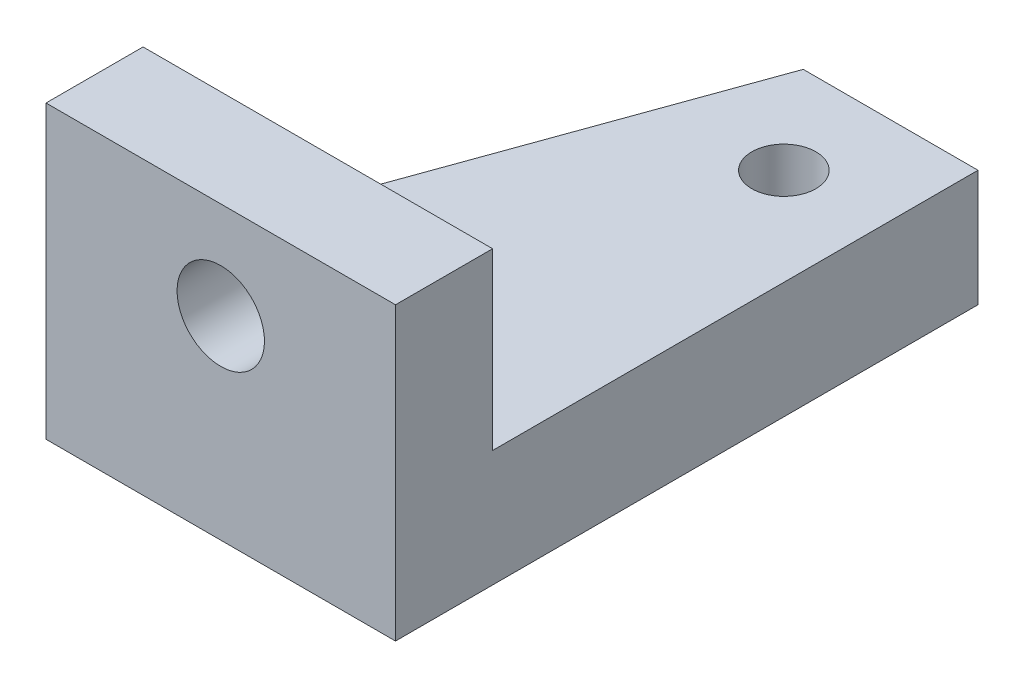
ISO-10303-21;
HEADER;
FILE_DESCRIPTION(('STEP AP214'),'2;1');
FILE_NAME('part.step','',(''),(''),'','','');
FILE_SCHEMA(('AUTOMOTIVE_DESIGN { 1 0 10303 214 1 1 1 1 }'));
ENDSEC;
DATA;
#1=APPLICATION_CONTEXT('core data for automotive mechanical design processes');
#2=APPLICATION_PROTOCOL_DEFINITION('international standard','automotive_design',2000,#1);
#3=PRODUCT_CONTEXT('',#1,'mechanical');
#4=PRODUCT('Part','Part','',(#3));
#5=PRODUCT_RELATED_PRODUCT_CATEGORY('part','',(#4));
#6=PRODUCT_DEFINITION_FORMATION('','',#4);
#7=PRODUCT_DEFINITION_CONTEXT('part definition',#1,'design');
#8=PRODUCT_DEFINITION('design','',#6,#7);
#9=PRODUCT_DEFINITION_SHAPE('','',#8);
#10=(LENGTH_UNIT() NAMED_UNIT(*) SI_UNIT(.MILLI.,.METRE.));
#11=(NAMED_UNIT(*) PLANE_ANGLE_UNIT() SI_UNIT($,.RADIAN.));
#12=(NAMED_UNIT(*) SI_UNIT($,.STERADIAN.) SOLID_ANGLE_UNIT());
#13=UNCERTAINTY_MEASURE_WITH_UNIT(LENGTH_MEASURE(1.E-05),#10,'distance_accuracy_value','');
#14=(GEOMETRIC_REPRESENTATION_CONTEXT(3) GLOBAL_UNCERTAINTY_ASSIGNED_CONTEXT((#13)) GLOBAL_UNIT_ASSIGNED_CONTEXT((#10,
#11,#12)) REPRESENTATION_CONTEXT('',''));
#15=CARTESIAN_POINT('',(0.,0.,0.));
#16=DIRECTION('',(0.,0.,1.));
#17=DIRECTION('',(1.,0.,0.));
#18=AXIS2_PLACEMENT_3D('',#15,#16,#17);
#19=CARTESIAN_POINT('',(9.,0.,-30.));
#20=DIRECTION('',(0.,1.,0.));
#21=DIRECTION('',(0.,0.,1.));
#22=AXIS2_PLACEMENT_3D('',#19,#20,#21);
#23=PLANE('',#22);
#24=CARTESIAN_POINT('',(4.,0.,-25.));
#25=DIRECTION('',(0.,-1.,0.));
#26=DIRECTION('',(0.,0.,-1.));
#27=AXIS2_PLACEMENT_3D('',#24,#25,#26);
#28=CIRCLE('',#27,1.64999999999999);
#29=CARTESIAN_POINT('',(4.,0.,-26.65));
#30=VERTEX_POINT('',#29);
#31=EDGE_CURVE('E157',#30,#30,#28,.T.);
#32=ORIENTED_EDGE('',*,*,#31,.F.);
#33=EDGE_LOOP('',(#32));
#34=FACE_BOUND('',#33,.T.);
#35=DIRECTION('',(-0.338719468272742,0.,0.940887411868727));
#36=VECTOR('',#35,1.);
#37=CARTESIAN_POINT('',(1.03257790368272,0.,-32.8682719546742));
#38=LINE('',#37,#36);
#39=CARTESIAN_POINT('',(0.,0.,-30.));
#40=VERTEX_POINT('',#39);
#41=CARTESIAN_POINT('',(-9.,0.,-5.));
#42=VERTEX_POINT('',#41);
#43=EDGE_CURVE('E61',#40,#42,#38,.T.);
#44=ORIENTED_EDGE('',*,*,#43,.F.);
#45=DIRECTION('',(-1.,0.,0.));
#46=VECTOR('',#45,1.);
#47=CARTESIAN_POINT('',(9.,0.,-30.));
#48=LINE('',#47,#46);
#49=CARTESIAN_POINT('',(9.,0.,-30.));
#50=VERTEX_POINT('',#49);
#51=EDGE_CURVE('E54',#50,#40,#48,.T.);
#52=ORIENTED_EDGE('',*,*,#51,.F.);
#53=DIRECTION('',(0.,0.,-1.));
#54=VECTOR('',#53,1.);
#55=CARTESIAN_POINT('',(9.,0.,-30.));
#56=LINE('',#55,#54);
#57=CARTESIAN_POINT('',(9.,0.,0.));
#58=VERTEX_POINT('',#57);
#59=EDGE_CURVE('E141',#58,#50,#56,.T.);
#60=ORIENTED_EDGE('',*,*,#59,.F.);
#61=DIRECTION('',(-1.,0.,0.));
#62=VECTOR('',#61,1.);
#63=CARTESIAN_POINT('',(9.,0.,0.));
#64=LINE('',#63,#62);
#65=CARTESIAN_POINT('',(-9.,0.,0.));
#66=VERTEX_POINT('',#65);
#67=EDGE_CURVE('E129',#58,#66,#64,.T.);
#68=ORIENTED_EDGE('',*,*,#67,.T.);
#69=DIRECTION('',(0.,0.,-1.));
#70=VECTOR('',#69,1.);
#71=CARTESIAN_POINT('',(-9.,0.,-30.));
#72=LINE('',#71,#70);
#73=EDGE_CURVE('E133',#66,#42,#72,.T.);
#74=ORIENTED_EDGE('',*,*,#73,.T.);
#75=EDGE_LOOP('',(#44,#52,#60,#68,#74));
#76=FACE_BOUND('',#75,.T.);
#77=ADVANCED_FACE('F47',(#34,#76),#23,.F.);
#78=CARTESIAN_POINT('',(9.,6.,-30.));
#79=DIRECTION('',(0.,0.,1.));
#80=DIRECTION('',(1.,0.,0.));
#81=AXIS2_PLACEMENT_3D('',#78,#79,#80);
#82=PLANE('',#81);
#83=DIRECTION('',(0.,1.,0.));
#84=VECTOR('',#83,1.);
#85=CARTESIAN_POINT('',(0.,-47.5821657766857,-30.));
#86=LINE('',#85,#84);
#87=CARTESIAN_POINT('',(0.,6.,-30.));
#88=VERTEX_POINT('',#87);
#89=EDGE_CURVE('E152',#40,#88,#86,.T.);
#90=ORIENTED_EDGE('',*,*,#89,.T.);
#91=DIRECTION('',(-1.,0.,0.));
#92=VECTOR('',#91,1.);
#93=CARTESIAN_POINT('',(9.,6.,-30.));
#94=LINE('',#93,#92);
#95=CARTESIAN_POINT('',(9.,6.,-30.));
#96=VERTEX_POINT('',#95);
#97=EDGE_CURVE('E145',#96,#88,#94,.T.);
#98=ORIENTED_EDGE('',*,*,#97,.F.);
#99=DIRECTION('',(0.,1.,0.));
#100=VECTOR('',#99,1.);
#101=CARTESIAN_POINT('',(9.,6.,-30.));
#102=LINE('',#101,#100);
#103=EDGE_CURVE('E96',#50,#96,#102,.T.);
#104=ORIENTED_EDGE('',*,*,#103,.F.);
#105=ORIENTED_EDGE('',*,*,#51,.T.);
#106=EDGE_LOOP('',(#90,#98,#104,#105));
#107=FACE_BOUND('',#106,.T.);
#108=ADVANCED_FACE('F150',(#107),#82,.F.);
#109=CARTESIAN_POINT('',(9.,6.,-5.));
#110=DIRECTION('',(0.,-1.,0.));
#111=DIRECTION('',(0.,0.,-1.));
#112=AXIS2_PLACEMENT_3D('',#109,#110,#111);
#113=PLANE('',#112);
#114=CARTESIAN_POINT('',(4.,6.,-25.));
#115=DIRECTION('',(0.,-1.,0.));
#116=DIRECTION('',(0.,0.,-1.));
#117=AXIS2_PLACEMENT_3D('',#114,#115,#116);
#118=CIRCLE('',#117,1.64999999999999);
#119=CARTESIAN_POINT('',(4.,6.,-26.65));
#120=VERTEX_POINT('',#119);
#121=EDGE_CURVE('E136',#120,#120,#118,.T.);
#122=ORIENTED_EDGE('',*,*,#121,.T.);
#123=EDGE_LOOP('',(#122));
#124=FACE_BOUND('',#123,.T.);
#125=DIRECTION('',(0.338719468272742,0.,-0.940887411868727));
#126=VECTOR('',#125,1.);
#127=CARTESIAN_POINT('',(-6.93484419263456,6.,-10.7365439093484));
#128=LINE('',#127,#126);
#129=CARTESIAN_POINT('',(-9.,6.,-5.));
#130=VERTEX_POINT('',#129);
#131=EDGE_CURVE('E158',#130,#88,#128,.T.);
#132=ORIENTED_EDGE('',*,*,#131,.F.);
#133=DIRECTION('',(-1.,0.,0.));
#134=VECTOR('',#133,1.);
#135=CARTESIAN_POINT('',(9.,6.,-5.));
#136=LINE('',#135,#134);
#137=CARTESIAN_POINT('',(9.,6.,-5.));
#138=VERTEX_POINT('',#137);
#139=EDGE_CURVE('E124',#138,#130,#136,.T.);
#140=ORIENTED_EDGE('',*,*,#139,.F.);
#141=DIRECTION('',(0.,0.,1.));
#142=VECTOR('',#141,1.);
#143=CARTESIAN_POINT('',(9.,6.,-5.));
#144=LINE('',#143,#142);
#145=EDGE_CURVE('E112',#96,#138,#144,.T.);
#146=ORIENTED_EDGE('',*,*,#145,.F.);
#147=ORIENTED_EDGE('',*,*,#97,.T.);
#148=EDGE_LOOP('',(#132,#140,#146,#147));
#149=FACE_BOUND('',#148,.T.);
#150=ADVANCED_FACE('F171',(#124,#149),#113,.F.);
#151=CARTESIAN_POINT('',(-9.,0.,0.));
#152=DIRECTION('',(-1.,0.,0.));
#153=DIRECTION('',(0.,0.,1.));
#154=AXIS2_PLACEMENT_3D('',#151,#152,#153);
#155=PLANE('',#154);
#156=DIRECTION('',(0.,1.,0.));
#157=VECTOR('',#156,1.);
#158=CARTESIAN_POINT('',(-9.,15.,-5.));
#159=LINE('',#158,#157);
#160=CARTESIAN_POINT('',(-9.,15.,-5.));
#161=VERTEX_POINT('',#160);
#162=EDGE_CURVE('E121',#130,#161,#159,.T.);
#163=ORIENTED_EDGE('',*,*,#162,.F.);
#164=DIRECTION('',(0.,-1.,0.));
#165=VECTOR('',#164,1.);
#166=CARTESIAN_POINT('',(-9.,0.,-5.));
#167=LINE('',#166,#165);
#168=EDGE_CURVE('E13',#130,#42,#167,.T.);
#169=ORIENTED_EDGE('',*,*,#168,.T.);
#170=ORIENTED_EDGE('',*,*,#73,.F.);
#171=DIRECTION('',(0.,-1.,0.));
#172=VECTOR('',#171,1.);
#173=CARTESIAN_POINT('',(-9.,0.,0.));
#174=LINE('',#173,#172);
#175=CARTESIAN_POINT('',(-9.,15.,0.));
#176=VERTEX_POINT('',#175);
#177=EDGE_CURVE('E87',#176,#66,#174,.T.);
#178=ORIENTED_EDGE('',*,*,#177,.F.);
#179=DIRECTION('',(0.,0.,1.));
#180=VECTOR('',#179,1.);
#181=CARTESIAN_POINT('',(-9.,15.,0.));
#182=LINE('',#181,#180);
#183=EDGE_CURVE('E138',#161,#176,#182,.T.);
#184=ORIENTED_EDGE('',*,*,#183,.F.);
#185=EDGE_LOOP('',(#163,#169,#170,#178,#184));
#186=FACE_BOUND('',#185,.T.);
#187=ADVANCED_FACE('F173',(#186),#155,.T.);
#188=CARTESIAN_POINT('',(9.,15.,-5.));
#189=DIRECTION('',(0.,0.,1.));
#190=DIRECTION('',(0.,-1.,0.));
#191=AXIS2_PLACEMENT_3D('',#188,#189,#190);
#192=PLANE('',#191);
#193=CARTESIAN_POINT('',(0.,10.,-5.));
#194=DIRECTION('',(0.,0.,-1.));
#195=DIRECTION('',(0.,1.,0.));
#196=AXIS2_PLACEMENT_3D('',#193,#194,#195);
#197=CIRCLE('',#196,2.24999999999999);
#198=CARTESIAN_POINT('',(0.,12.25,-5.));
#199=VERTEX_POINT('',#198);
#200=EDGE_CURVE('E274',#199,#199,#197,.T.);
#201=ORIENTED_EDGE('',*,*,#200,.F.);
#202=EDGE_LOOP('',(#201));
#203=FACE_BOUND('',#202,.T.);
#204=ORIENTED_EDGE('',*,*,#162,.T.);
#205=DIRECTION('',(-1.,0.,0.));
#206=VECTOR('',#205,1.);
#207=CARTESIAN_POINT('',(9.,15.,-5.));
#208=LINE('',#207,#206);
#209=CARTESIAN_POINT('',(9.,15.,-5.));
#210=VERTEX_POINT('',#209);
#211=EDGE_CURVE('E118',#210,#161,#208,.T.);
#212=ORIENTED_EDGE('',*,*,#211,.F.);
#213=DIRECTION('',(0.,1.,0.));
#214=VECTOR('',#213,1.);
#215=CARTESIAN_POINT('',(9.,15.,-5.));
#216=LINE('',#215,#214);
#217=EDGE_CURVE('E105',#138,#210,#216,.T.);
#218=ORIENTED_EDGE('',*,*,#217,.F.);
#219=ORIENTED_EDGE('',*,*,#139,.T.);
#220=EDGE_LOOP('',(#204,#212,#218,#219));
#221=FACE_BOUND('',#220,.T.);
#222=ADVANCED_FACE('F119',(#203,#221),#192,.F.);
#223=CARTESIAN_POINT('',(9.,15.,0.));
#224=DIRECTION('',(0.,-1.,0.));
#225=DIRECTION('',(0.,0.,-1.));
#226=AXIS2_PLACEMENT_3D('',#223,#224,#225);
#227=PLANE('',#226);
#228=ORIENTED_EDGE('',*,*,#183,.T.);
#229=DIRECTION('',(-1.,0.,0.));
#230=VECTOR('',#229,1.);
#231=CARTESIAN_POINT('',(9.,15.,0.));
#232=LINE('',#231,#230);
#233=CARTESIAN_POINT('',(9.,15.,0.));
#234=VERTEX_POINT('',#233);
#235=EDGE_CURVE('E125',#234,#176,#232,.T.);
#236=ORIENTED_EDGE('',*,*,#235,.F.);
#237=DIRECTION('',(0.,0.,1.));
#238=VECTOR('',#237,1.);
#239=CARTESIAN_POINT('',(9.,15.,0.));
#240=LINE('',#239,#238);
#241=EDGE_CURVE('E109',#210,#234,#240,.T.);
#242=ORIENTED_EDGE('',*,*,#241,.F.);
#243=ORIENTED_EDGE('',*,*,#211,.T.);
#244=EDGE_LOOP('',(#228,#236,#242,#243));
#245=FACE_BOUND('',#244,.T.);
#246=ADVANCED_FACE('F127',(#245),#227,.F.);
#247=CARTESIAN_POINT('',(9.,0.,0.));
#248=DIRECTION('',(0.,0.,-1.));
#249=DIRECTION('',(-1.,0.,0.));
#250=AXIS2_PLACEMENT_3D('',#247,#248,#249);
#251=PLANE('',#250);
#252=CARTESIAN_POINT('',(0.,10.,0.));
#253=DIRECTION('',(0.,0.,-1.));
#254=DIRECTION('',(-1.,0.,0.));
#255=AXIS2_PLACEMENT_3D('',#252,#253,#254);
#256=CIRCLE('',#255,2.24999999999999);
#257=CARTESIAN_POINT('',(-2.24999999999999,10.,0.));
#258=VERTEX_POINT('',#257);
#259=EDGE_CURVE('E271',#258,#258,#256,.T.);
#260=ORIENTED_EDGE('',*,*,#259,.T.);
#261=EDGE_LOOP('',(#260));
#262=FACE_BOUND('',#261,.T.);
#263=ORIENTED_EDGE('',*,*,#177,.T.);
#264=ORIENTED_EDGE('',*,*,#67,.F.);
#265=DIRECTION('',(0.,-1.,0.));
#266=VECTOR('',#265,1.);
#267=CARTESIAN_POINT('',(9.,0.,0.));
#268=LINE('',#267,#266);
#269=EDGE_CURVE('E69',#234,#58,#268,.T.);
#270=ORIENTED_EDGE('',*,*,#269,.F.);
#271=ORIENTED_EDGE('',*,*,#235,.T.);
#272=EDGE_LOOP('',(#263,#264,#270,#271));
#273=FACE_BOUND('',#272,.T.);
#274=ADVANCED_FACE('F174',(#262,#273),#251,.F.);
#275=CARTESIAN_POINT('',(9.,0.,0.));
#276=DIRECTION('',(-1.,0.,0.));
#277=DIRECTION('',(0.,0.,1.));
#278=AXIS2_PLACEMENT_3D('',#275,#276,#277);
#279=PLANE('',#278);
#280=ORIENTED_EDGE('',*,*,#59,.T.);
#281=ORIENTED_EDGE('',*,*,#103,.T.);
#282=ORIENTED_EDGE('',*,*,#145,.T.);
#283=ORIENTED_EDGE('',*,*,#217,.T.);
#284=ORIENTED_EDGE('',*,*,#241,.T.);
#285=ORIENTED_EDGE('',*,*,#269,.T.);
#286=EDGE_LOOP('',(#280,#281,#282,#283,#284,#285));
#287=FACE_BOUND('',#286,.T.);
#288=ADVANCED_FACE('F107',(#287),#279,.F.);
#289=CARTESIAN_POINT('',(4.,0.,-25.));
#290=DIRECTION('',(0.,-1.,0.));
#291=DIRECTION('',(0.,0.,-1.));
#292=AXIS2_PLACEMENT_3D('',#289,#290,#291);
#293=CYLINDRICAL_SURFACE('',#292,1.64999999999999);
#294=ORIENTED_EDGE('',*,*,#121,.F.);
#295=EDGE_LOOP('',(#294));
#296=FACE_BOUND('',#295,.T.);
#297=ORIENTED_EDGE('',*,*,#31,.T.);
#298=EDGE_LOOP('',(#297));
#299=FACE_BOUND('',#298,.T.);
#300=ADVANCED_FACE('F182',(#296,#299),#293,.F.);
#301=CARTESIAN_POINT('',(0.,-47.5821657766857,-30.));
#302=DIRECTION('',(-0.940887411868727,0.,-0.338719468272742));
#303=DIRECTION('',(-0.338719468272742,0.,0.940887411868727));
#304=AXIS2_PLACEMENT_3D('',#301,#302,#303);
#305=PLANE('',#304);
#306=ORIENTED_EDGE('',*,*,#89,.F.);
#307=ORIENTED_EDGE('',*,*,#43,.T.);
#308=ORIENTED_EDGE('',*,*,#168,.F.);
#309=ORIENTED_EDGE('',*,*,#131,.T.);
#310=EDGE_LOOP('',(#306,#307,#308,#309));
#311=FACE_BOUND('',#310,.T.);
#312=ADVANCED_FACE('F195',(#311),#305,.T.);
#313=CARTESIAN_POINT('',(0.,10.,-5.));
#314=DIRECTION('',(0.,0.,-1.));
#315=DIRECTION('',(0.,1.,0.));
#316=AXIS2_PLACEMENT_3D('',#313,#314,#315);
#317=CYLINDRICAL_SURFACE('',#316,2.24999999999999);
#318=ORIENTED_EDGE('',*,*,#259,.F.);
#319=EDGE_LOOP('',(#318));
#320=FACE_BOUND('',#319,.T.);
#321=ORIENTED_EDGE('',*,*,#200,.T.);
#322=EDGE_LOOP('',(#321));
#323=FACE_BOUND('',#322,.T.);
#324=ADVANCED_FACE('F201',(#320,#323),#317,.F.);
#325=CLOSED_SHELL('',(#77,#108,#150,#187,#222,#246,#274,#288,#300,#312,#324));
#326=MANIFOLD_SOLID_BREP('B2',#325);
#327=ADVANCED_BREP_SHAPE_REPRESENTATION('',(#18,#326),#14);
#328=SHAPE_DEFINITION_REPRESENTATION(#9,#327);
ENDSEC;
END-ISO-10303-21;
